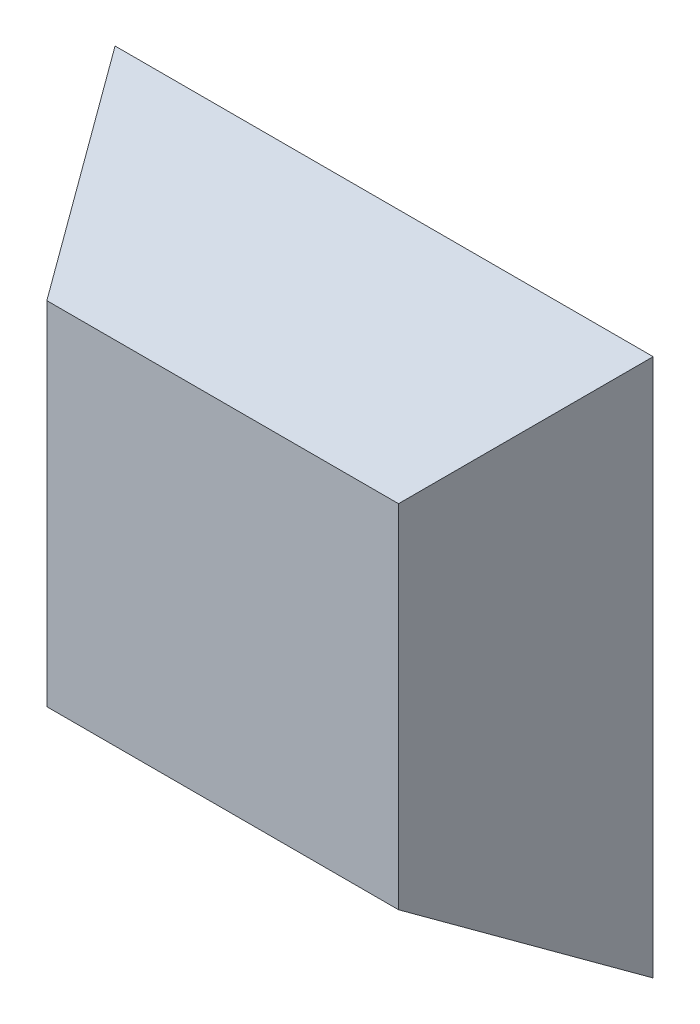
ISO-10303-21;
HEADER;
FILE_DESCRIPTION(('STEP AP214'),'2;1');
FILE_NAME('part.step','',(''),(''),'','','');
FILE_SCHEMA(('AUTOMOTIVE_DESIGN { 1 0 10303 214 1 1 1 1 }'));
ENDSEC;
DATA;
#1=APPLICATION_CONTEXT('core data for automotive mechanical design processes');
#2=APPLICATION_PROTOCOL_DEFINITION('international standard','automotive_design',2000,#1);
#3=PRODUCT_CONTEXT('',#1,'mechanical');
#4=PRODUCT('Part','Part','',(#3));
#5=PRODUCT_RELATED_PRODUCT_CATEGORY('part','',(#4));
#6=PRODUCT_DEFINITION_FORMATION('','',#4);
#7=PRODUCT_DEFINITION_CONTEXT('part definition',#1,'design');
#8=PRODUCT_DEFINITION('design','',#6,#7);
#9=PRODUCT_DEFINITION_SHAPE('','',#8);
#10=(LENGTH_UNIT() NAMED_UNIT(*) SI_UNIT(.MILLI.,.METRE.));
#11=(NAMED_UNIT(*) PLANE_ANGLE_UNIT() SI_UNIT($,.RADIAN.));
#12=(NAMED_UNIT(*) SI_UNIT($,.STERADIAN.) SOLID_ANGLE_UNIT());
#13=UNCERTAINTY_MEASURE_WITH_UNIT(LENGTH_MEASURE(1.E-05),#10,'distance_accuracy_value','');
#14=(GEOMETRIC_REPRESENTATION_CONTEXT(3) GLOBAL_UNCERTAINTY_ASSIGNED_CONTEXT((#13)) GLOBAL_UNIT_ASSIGNED_CONTEXT((#10,
#11,#12)) REPRESENTATION_CONTEXT('',''));
#15=CARTESIAN_POINT('',(0.,0.,0.));
#16=DIRECTION('',(0.,0.,1.));
#17=DIRECTION('',(1.,0.,0.));
#18=AXIS2_PLACEMENT_3D('',#15,#16,#17);
#19=CARTESIAN_POINT('',(-200.,-200.,0.));
#20=DIRECTION('',(-0.866025403784438,0.,0.5));
#21=DIRECTION('',(0.5,0.,0.866025403784438));
#22=AXIS2_PLACEMENT_3D('',#19,#20,#21);
#23=PLANE('',#22);
#24=DIRECTION('',(0.,-1.,0.));
#25=VECTOR('',#24,1.);
#26=CARTESIAN_POINT('',(-200.,-200.,0.));
#27=LINE('',#26,#25);
#28=CARTESIAN_POINT('',(-200.,200.,0.));
#29=VERTEX_POINT('',#28);
#30=CARTESIAN_POINT('',(-200.,-200.,0.));
#31=VERTEX_POINT('',#30);
#32=EDGE_CURVE('E86',#29,#31,#27,.T.);
#33=ORIENTED_EDGE('',*,*,#32,.T.);
#34=DIRECTION('',(-0.447213595499958,-0.447213595499958,-0.774596669241483));
#35=VECTOR('',#34,1.);
#36=CARTESIAN_POINT('',(-120.,-120.,138.56406460551));
#37=LINE('',#36,#35);
#38=CARTESIAN_POINT('',(-130.717967697245,-130.717967697245,120.));
#39=VERTEX_POINT('',#38);
#40=EDGE_CURVE('E11',#39,#31,#37,.T.);
#41=ORIENTED_EDGE('',*,*,#40,.F.);
#42=DIRECTION('',(0.,1.,0.));
#43=VECTOR('',#42,1.);
#44=CARTESIAN_POINT('',(-130.717967697245,-200.,120.));
#45=LINE('',#44,#43);
#46=CARTESIAN_POINT('',(-130.717967697245,130.717967697245,120.));
#47=VERTEX_POINT('',#46);
#48=EDGE_CURVE('E106',#47,#39,#45,.F.);
#49=ORIENTED_EDGE('',*,*,#48,.F.);
#50=DIRECTION('',(-0.447213595499958,0.447213595499958,-0.774596669241483));
#51=VECTOR('',#50,1.);
#52=CARTESIAN_POINT('',(-120.,120.,138.56406460551));
#53=LINE('',#52,#51);
#54=EDGE_CURVE('E98',#47,#29,#53,.T.);
#55=ORIENTED_EDGE('',*,*,#54,.T.);
#56=EDGE_LOOP('',(#33,#41,#49,#55));
#57=FACE_BOUND('',#56,.T.);
#58=ADVANCED_FACE('F39',(#57),#23,.T.);
#59=CARTESIAN_POINT('',(200.,-200.,0.));
#60=DIRECTION('',(0.,-0.866025403784438,0.5));
#61=DIRECTION('',(0.,-0.5,-0.866025403784438));
#62=AXIS2_PLACEMENT_3D('',#59,#60,#61);
#63=PLANE('',#62);
#64=DIRECTION('',(1.,0.,0.));
#65=VECTOR('',#64,1.);
#66=CARTESIAN_POINT('',(200.,-200.,0.));
#67=LINE('',#66,#65);
#68=CARTESIAN_POINT('',(200.,-200.,0.));
#69=VERTEX_POINT('',#68);
#70=EDGE_CURVE('E82',#31,#69,#67,.T.);
#71=ORIENTED_EDGE('',*,*,#70,.T.);
#72=DIRECTION('',(0.447213595499958,-0.447213595499958,-0.774596669241483));
#73=VECTOR('',#72,1.);
#74=CARTESIAN_POINT('',(200.,-200.,0.));
#75=LINE('',#74,#73);
#76=CARTESIAN_POINT('',(130.717967697245,-130.717967697245,120.));
#77=VERTEX_POINT('',#76);
#78=EDGE_CURVE('E49',#77,#69,#75,.T.);
#79=ORIENTED_EDGE('',*,*,#78,.F.);
#80=DIRECTION('',(-1.,0.,0.));
#81=VECTOR('',#80,1.);
#82=CARTESIAN_POINT('',(200.,-130.717967697245,120.));
#83=LINE('',#82,#81);
#84=EDGE_CURVE('E94',#39,#77,#83,.F.);
#85=ORIENTED_EDGE('',*,*,#84,.F.);
#86=ORIENTED_EDGE('',*,*,#40,.T.);
#87=EDGE_LOOP('',(#71,#79,#85,#86));
#88=FACE_BOUND('',#87,.T.);
#89=ADVANCED_FACE('F41',(#88),#63,.T.);
#90=CARTESIAN_POINT('',(200.,-200.,0.));
#91=DIRECTION('',(0.866025403784438,0.,0.5));
#92=DIRECTION('',(0.5,0.,-0.866025403784438));
#93=AXIS2_PLACEMENT_3D('',#90,#91,#92);
#94=PLANE('',#93);
#95=DIRECTION('',(0.,1.,0.));
#96=VECTOR('',#95,1.);
#97=CARTESIAN_POINT('',(200.,-200.,0.));
#98=LINE('',#97,#96);
#99=CARTESIAN_POINT('',(200.,200.,0.));
#100=VERTEX_POINT('',#99);
#101=EDGE_CURVE('E87',#69,#100,#98,.T.);
#102=ORIENTED_EDGE('',*,*,#101,.T.);
#103=DIRECTION('',(0.447213595499958,0.447213595499958,-0.774596669241483));
#104=VECTOR('',#103,1.);
#105=CARTESIAN_POINT('',(200.,200.,0.));
#106=LINE('',#105,#104);
#107=CARTESIAN_POINT('',(130.717967697245,130.717967697245,120.));
#108=VERTEX_POINT('',#107);
#109=EDGE_CURVE('E110',#108,#100,#106,.T.);
#110=ORIENTED_EDGE('',*,*,#109,.F.);
#111=DIRECTION('',(0.,-1.,0.));
#112=VECTOR('',#111,1.);
#113=CARTESIAN_POINT('',(130.717967697245,-200.,120.));
#114=LINE('',#113,#112);
#115=EDGE_CURVE('E61',#77,#108,#114,.F.);
#116=ORIENTED_EDGE('',*,*,#115,.F.);
#117=ORIENTED_EDGE('',*,*,#78,.T.);
#118=EDGE_LOOP('',(#102,#110,#116,#117));
#119=FACE_BOUND('',#118,.T.);
#120=ADVANCED_FACE('F123',(#119),#94,.T.);
#121=CARTESIAN_POINT('',(200.,200.,0.));
#122=DIRECTION('',(0.,0.866025403784438,0.5));
#123=DIRECTION('',(0.,-0.5,0.866025403784438));
#124=AXIS2_PLACEMENT_3D('',#121,#122,#123);
#125=PLANE('',#124);
#126=DIRECTION('',(-1.,0.,0.));
#127=VECTOR('',#126,1.);
#128=CARTESIAN_POINT('',(200.,200.,0.));
#129=LINE('',#128,#127);
#130=EDGE_CURVE('E104',#100,#29,#129,.T.);
#131=ORIENTED_EDGE('',*,*,#130,.T.);
#132=ORIENTED_EDGE('',*,*,#54,.F.);
#133=DIRECTION('',(1.,0.,0.));
#134=VECTOR('',#133,1.);
#135=CARTESIAN_POINT('',(200.,130.717967697245,120.));
#136=LINE('',#135,#134);
#137=EDGE_CURVE('E43',#108,#47,#136,.F.);
#138=ORIENTED_EDGE('',*,*,#137,.F.);
#139=ORIENTED_EDGE('',*,*,#109,.T.);
#140=EDGE_LOOP('',(#131,#132,#138,#139));
#141=FACE_BOUND('',#140,.T.);
#142=ADVANCED_FACE('F125',(#141),#125,.T.);
#143=CARTESIAN_POINT('',(0.,0.,120.));
#144=DIRECTION('',(0.,0.,1.));
#145=DIRECTION('',(1.,0.,0.));
#146=AXIS2_PLACEMENT_3D('',#143,#144,#145);
#147=PLANE('',#146);
#148=ORIENTED_EDGE('',*,*,#48,.T.);
#149=ORIENTED_EDGE('',*,*,#84,.T.);
#150=ORIENTED_EDGE('',*,*,#115,.T.);
#151=ORIENTED_EDGE('',*,*,#137,.T.);
#152=EDGE_LOOP('',(#148,#149,#150,#151));
#153=FACE_BOUND('',#152,.T.);
#154=ADVANCED_FACE('F121',(#153),#147,.T.);
#155=CARTESIAN_POINT('',(0.,0.,0.));
#156=DIRECTION('',(0.,0.,1.));
#157=DIRECTION('',(1.,0.,0.));
#158=AXIS2_PLACEMENT_3D('',#155,#156,#157);
#159=PLANE('',#158);
#160=ORIENTED_EDGE('',*,*,#32,.F.);
#161=ORIENTED_EDGE('',*,*,#130,.F.);
#162=ORIENTED_EDGE('',*,*,#101,.F.);
#163=ORIENTED_EDGE('',*,*,#70,.F.);
#164=EDGE_LOOP('',(#160,#161,#162,#163));
#165=FACE_BOUND('',#164,.T.);
#166=ADVANCED_FACE('F83',(#165),#159,.F.);
#167=CLOSED_SHELL('',(#58,#89,#120,#142,#154,#166));
#168=MANIFOLD_SOLID_BREP('B2',#167);
#169=ADVANCED_BREP_SHAPE_REPRESENTATION('',(#18,#168),#14);
#170=SHAPE_DEFINITION_REPRESENTATION(#9,#169);
ENDSEC;
END-ISO-10303-21;
